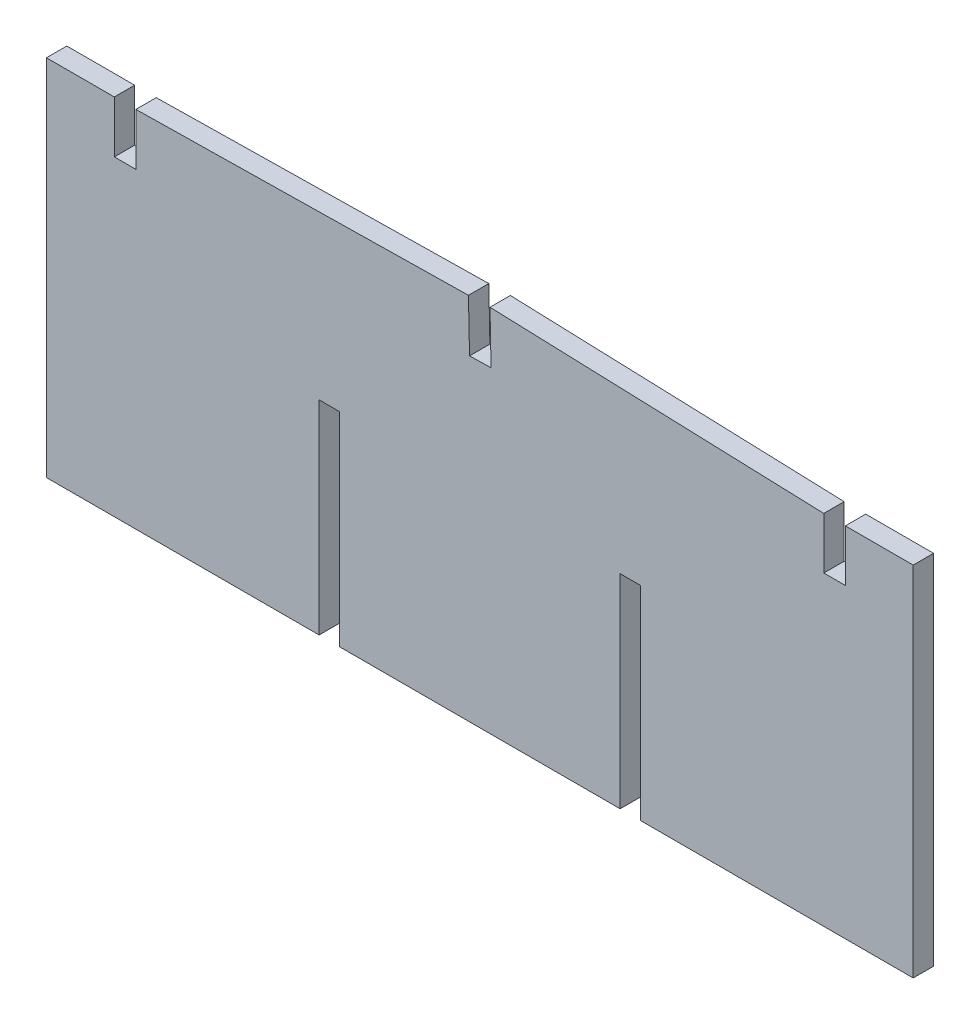
ISO-10303-21;
HEADER;
FILE_DESCRIPTION(('STEP AP214'),'2;1');
FILE_NAME('part.step','',(''),(''),'','','');
FILE_SCHEMA(('AUTOMOTIVE_DESIGN { 1 0 10303 214 1 1 1 1 }'));
ENDSEC;
DATA;
#1=APPLICATION_CONTEXT('core data for automotive mechanical design processes');
#2=APPLICATION_PROTOCOL_DEFINITION('international standard','automotive_design',2000,#1);
#3=PRODUCT_CONTEXT('',#1,'mechanical');
#4=PRODUCT('Part','Part','',(#3));
#5=PRODUCT_RELATED_PRODUCT_CATEGORY('part','',(#4));
#6=PRODUCT_DEFINITION_FORMATION('','',#4);
#7=PRODUCT_DEFINITION_CONTEXT('part definition',#1,'design');
#8=PRODUCT_DEFINITION('design','',#6,#7);
#9=PRODUCT_DEFINITION_SHAPE('','',#8);
#10=(LENGTH_UNIT() NAMED_UNIT(*) SI_UNIT(.MILLI.,.METRE.));
#11=(NAMED_UNIT(*) PLANE_ANGLE_UNIT() SI_UNIT($,.RADIAN.));
#12=(NAMED_UNIT(*) SI_UNIT($,.STERADIAN.) SOLID_ANGLE_UNIT());
#13=UNCERTAINTY_MEASURE_WITH_UNIT(LENGTH_MEASURE(1.E-05),#10,'distance_accuracy_value','');
#14=(GEOMETRIC_REPRESENTATION_CONTEXT(3) GLOBAL_UNCERTAINTY_ASSIGNED_CONTEXT((#13)) GLOBAL_UNIT_ASSIGNED_CONTEXT((#10,
#11,#12)) REPRESENTATION_CONTEXT('',''));
#15=CARTESIAN_POINT('',(0.,0.,0.));
#16=DIRECTION('',(0.,0.,1.));
#17=DIRECTION('',(1.,0.,0.));
#18=AXIS2_PLACEMENT_3D('',#15,#16,#17);
#19=CARTESIAN_POINT('',(374.396000000001,61.5214781068035,-356.));
#20=DIRECTION('',(-1.,0.,0.));
#21=DIRECTION('',(0.,0.,1.));
#22=AXIS2_PLACEMENT_3D('',#19,#20,#21);
#23=PLANE('',#22);
#24=DIRECTION('',(0.,-1.,0.));
#25=VECTOR('',#24,1.);
#26=CARTESIAN_POINT('',(374.396000000001,61.5214781068035,-353.));
#27=LINE('',#26,#25);
#28=CARTESIAN_POINT('',(374.396000000001,69.1249507450922,-353.));
#29=VERTEX_POINT('',#28);
#30=CARTESIAN_POINT('',(374.396000000001,61.5214781068035,-353.));
#31=VERTEX_POINT('',#30);
#32=EDGE_CURVE('E226',#29,#31,#27,.T.);
#33=ORIENTED_EDGE('',*,*,#32,.F.);
#34=DIRECTION('',(0.,0.,1.));
#35=VECTOR('',#34,1.);
#36=CARTESIAN_POINT('',(374.396000000001,69.1249507450922,-356.));
#37=LINE('',#36,#35);
#38=CARTESIAN_POINT('',(374.396000000001,69.1249507450922,-356.));
#39=VERTEX_POINT('',#38);
#40=EDGE_CURVE('E11',#39,#29,#37,.T.);
#41=ORIENTED_EDGE('',*,*,#40,.F.);
#42=DIRECTION('',(0.,-1.,0.));
#43=VECTOR('',#42,1.);
#44=CARTESIAN_POINT('',(374.396000000001,61.5214781068035,-356.));
#45=LINE('',#44,#43);
#46=CARTESIAN_POINT('',(374.396000000001,61.5214781068035,-356.));
#47=VERTEX_POINT('',#46);
#48=EDGE_CURVE('E294',#39,#47,#45,.T.);
#49=ORIENTED_EDGE('',*,*,#48,.T.);
#50=DIRECTION('',(0.,0.,1.));
#51=VECTOR('',#50,1.);
#52=CARTESIAN_POINT('',(374.396000000001,61.5214781068035,-356.));
#53=LINE('',#52,#51);
#54=EDGE_CURVE('E36',#47,#31,#53,.T.);
#55=ORIENTED_EDGE('',*,*,#54,.T.);
#56=EDGE_LOOP('',(#33,#41,#49,#55));
#57=FACE_BOUND('',#56,.T.);
#58=ADVANCED_FACE('F33',(#57),#23,.T.);
#59=CARTESIAN_POINT('',(374.396000000001,69.1249507450922,-356.));
#60=DIRECTION('',(0.,1.,0.));
#61=DIRECTION('',(0.,0.,1.));
#62=AXIS2_PLACEMENT_3D('',#59,#60,#61);
#63=PLANE('',#62);
#64=DIRECTION('',(-1.,0.,0.));
#65=VECTOR('',#64,1.);
#66=CARTESIAN_POINT('',(374.396000000001,69.1249507450922,-353.));
#67=LINE('',#66,#65);
#68=CARTESIAN_POINT('',(384.396000000001,69.1249507450922,-353.));
#69=VERTEX_POINT('',#68);
#70=EDGE_CURVE('E292',#69,#29,#67,.T.);
#71=ORIENTED_EDGE('',*,*,#70,.F.);
#72=DIRECTION('',(0.,0.,1.));
#73=VECTOR('',#72,1.);
#74=CARTESIAN_POINT('',(384.396000000001,69.1249507450922,-356.));
#75=LINE('',#74,#73);
#76=CARTESIAN_POINT('',(384.396000000001,69.1249507450922,-356.));
#77=VERTEX_POINT('',#76);
#78=EDGE_CURVE('E42',#77,#69,#75,.T.);
#79=ORIENTED_EDGE('',*,*,#78,.F.);
#80=DIRECTION('',(-1.,0.,0.));
#81=VECTOR('',#80,1.);
#82=CARTESIAN_POINT('',(374.396000000001,69.1249507450922,-356.));
#83=LINE('',#82,#81);
#84=EDGE_CURVE('E216',#77,#39,#83,.T.);
#85=ORIENTED_EDGE('',*,*,#84,.T.);
#86=ORIENTED_EDGE('',*,*,#40,.T.);
#87=EDGE_LOOP('',(#71,#79,#85,#86));
#88=FACE_BOUND('',#87,.T.);
#89=ADVANCED_FACE('F338',(#88),#63,.T.);
#90=CARTESIAN_POINT('',(384.396000000001,69.1249507450922,-356.));
#91=DIRECTION('',(1.,0.,0.));
#92=DIRECTION('',(0.,0.,-1.));
#93=AXIS2_PLACEMENT_3D('',#90,#91,#92);
#94=PLANE('',#93);
#95=DIRECTION('',(0.,1.,0.));
#96=VECTOR('',#95,1.);
#97=CARTESIAN_POINT('',(384.396000000001,69.1249507450922,-353.));
#98=LINE('',#97,#96);
#99=CARTESIAN_POINT('',(384.396000000001,16.4388254453726,-353.));
#100=VERTEX_POINT('',#99);
#101=EDGE_CURVE('E203',#100,#69,#98,.T.);
#102=ORIENTED_EDGE('',*,*,#101,.F.);
#103=DIRECTION('',(0.,0.,1.));
#104=VECTOR('',#103,1.);
#105=CARTESIAN_POINT('',(384.396000000001,16.4388254453726,-356.));
#106=LINE('',#105,#104);
#107=CARTESIAN_POINT('',(384.396000000001,16.4388254453726,-356.));
#108=VERTEX_POINT('',#107);
#109=EDGE_CURVE('E198',#108,#100,#106,.T.);
#110=ORIENTED_EDGE('',*,*,#109,.F.);
#111=DIRECTION('',(0.,1.,0.));
#112=VECTOR('',#111,1.);
#113=CARTESIAN_POINT('',(384.396000000001,69.1249507450922,-356.));
#114=LINE('',#113,#112);
#115=EDGE_CURVE('E201',#108,#77,#114,.T.);
#116=ORIENTED_EDGE('',*,*,#115,.T.);
#117=ORIENTED_EDGE('',*,*,#78,.T.);
#118=EDGE_LOOP('',(#102,#110,#116,#117));
#119=FACE_BOUND('',#118,.T.);
#120=ADVANCED_FACE('F200',(#119),#94,.T.);
#121=CARTESIAN_POINT('',(384.396000000001,16.4388254453726,-356.));
#122=DIRECTION('',(0.,-1.,0.));
#123=DIRECTION('',(1.,0.,0.));
#124=AXIS2_PLACEMENT_3D('',#121,#122,#123);
#125=PLANE('',#124);
#126=DIRECTION('',(1.,0.,0.));
#127=VECTOR('',#126,1.);
#128=CARTESIAN_POINT('',(384.396000000001,16.4388254453726,-353.));
#129=LINE('',#128,#127);
#130=CARTESIAN_POINT('',(344.221,16.4388254453726,-353.));
#131=VERTEX_POINT('',#130);
#132=EDGE_CURVE('E289',#131,#100,#129,.T.);
#133=ORIENTED_EDGE('',*,*,#132,.F.);
#134=DIRECTION('',(0.,0.,1.));
#135=VECTOR('',#134,1.);
#136=CARTESIAN_POINT('',(344.221,16.4388254453726,-356.));
#137=LINE('',#136,#135);
#138=CARTESIAN_POINT('',(344.221,16.4388254453726,-356.));
#139=VERTEX_POINT('',#138);
#140=EDGE_CURVE('E208',#139,#131,#137,.T.);
#141=ORIENTED_EDGE('',*,*,#140,.F.);
#142=DIRECTION('',(1.,0.,0.));
#143=VECTOR('',#142,1.);
#144=CARTESIAN_POINT('',(384.396000000001,16.4388254453726,-356.));
#145=LINE('',#144,#143);
#146=EDGE_CURVE('E214',#139,#108,#145,.T.);
#147=ORIENTED_EDGE('',*,*,#146,.T.);
#148=ORIENTED_EDGE('',*,*,#109,.T.);
#149=EDGE_LOOP('',(#133,#141,#147,#148));
#150=FACE_BOUND('',#149,.T.);
#151=ADVANCED_FACE('F218',(#150),#125,.T.);
#152=CARTESIAN_POINT('',(344.221,46.4388254453726,-356.));
#153=DIRECTION('',(-1.,0.,0.));
#154=DIRECTION('',(0.,0.,1.));
#155=AXIS2_PLACEMENT_3D('',#152,#153,#154);
#156=PLANE('',#155);
#157=DIRECTION('',(0.,-1.,0.));
#158=VECTOR('',#157,1.);
#159=CARTESIAN_POINT('',(344.221,46.4388254453726,-353.));
#160=LINE('',#159,#158);
#161=CARTESIAN_POINT('',(344.221,46.4388254453726,-353.));
#162=VERTEX_POINT('',#161);
#163=EDGE_CURVE('E286',#162,#131,#160,.T.);
#164=ORIENTED_EDGE('',*,*,#163,.F.);
#165=DIRECTION('',(0.,0.,1.));
#166=VECTOR('',#165,1.);
#167=CARTESIAN_POINT('',(344.221,46.4388254453726,-356.));
#168=LINE('',#167,#166);
#169=CARTESIAN_POINT('',(344.221,46.4388254453726,-356.));
#170=VERTEX_POINT('',#169);
#171=EDGE_CURVE('E298',#170,#162,#168,.T.);
#172=ORIENTED_EDGE('',*,*,#171,.F.);
#173=DIRECTION('',(0.,-1.,0.));
#174=VECTOR('',#173,1.);
#175=CARTESIAN_POINT('',(344.221,46.4388254453726,-356.));
#176=LINE('',#175,#174);
#177=EDGE_CURVE('E219',#170,#139,#176,.T.);
#178=ORIENTED_EDGE('',*,*,#177,.T.);
#179=ORIENTED_EDGE('',*,*,#140,.T.);
#180=EDGE_LOOP('',(#164,#172,#178,#179));
#181=FACE_BOUND('',#180,.T.);
#182=ADVANCED_FACE('F351',(#181),#156,.T.);
#183=CARTESIAN_POINT('',(341.221,46.4388254453726,-356.));
#184=DIRECTION('',(0.,-1.,0.));
#185=DIRECTION('',(0.,0.,-1.));
#186=AXIS2_PLACEMENT_3D('',#183,#184,#185);
#187=PLANE('',#186);
#188=DIRECTION('',(1.,0.,0.));
#189=VECTOR('',#188,1.);
#190=CARTESIAN_POINT('',(341.221,46.4388254453726,-353.));
#191=LINE('',#190,#189);
#192=CARTESIAN_POINT('',(341.221,46.4388254453726,-353.));
#193=VERTEX_POINT('',#192);
#194=EDGE_CURVE('E283',#193,#162,#191,.T.);
#195=ORIENTED_EDGE('',*,*,#194,.F.);
#196=DIRECTION('',(0.,0.,1.));
#197=VECTOR('',#196,1.);
#198=CARTESIAN_POINT('',(341.221,46.4388254453726,-356.));
#199=LINE('',#198,#197);
#200=CARTESIAN_POINT('',(341.221,46.4388254453726,-356.));
#201=VERTEX_POINT('',#200);
#202=EDGE_CURVE('E300',#201,#193,#199,.T.);
#203=ORIENTED_EDGE('',*,*,#202,.F.);
#204=DIRECTION('',(1.,0.,0.));
#205=VECTOR('',#204,1.);
#206=CARTESIAN_POINT('',(341.221,46.4388254453726,-356.));
#207=LINE('',#206,#205);
#208=EDGE_CURVE('E221',#201,#170,#207,.T.);
#209=ORIENTED_EDGE('',*,*,#208,.T.);
#210=ORIENTED_EDGE('',*,*,#171,.T.);
#211=EDGE_LOOP('',(#195,#203,#209,#210));
#212=FACE_BOUND('',#211,.T.);
#213=ADVANCED_FACE('F354',(#212),#187,.T.);
#214=CARTESIAN_POINT('',(341.221,16.4388254453726,-356.));
#215=DIRECTION('',(1.,0.,0.));
#216=DIRECTION('',(0.,0.,-1.));
#217=AXIS2_PLACEMENT_3D('',#214,#215,#216);
#218=PLANE('',#217);
#219=DIRECTION('',(0.,1.,0.));
#220=VECTOR('',#219,1.);
#221=CARTESIAN_POINT('',(341.221,16.4388254453726,-353.));
#222=LINE('',#221,#220);
#223=CARTESIAN_POINT('',(341.221,16.4388254453726,-353.));
#224=VERTEX_POINT('',#223);
#225=EDGE_CURVE('E280',#224,#193,#222,.T.);
#226=ORIENTED_EDGE('',*,*,#225,.F.);
#227=DIRECTION('',(0.,0.,1.));
#228=VECTOR('',#227,1.);
#229=CARTESIAN_POINT('',(341.221,16.4388254453726,-356.));
#230=LINE('',#229,#228);
#231=CARTESIAN_POINT('',(341.221,16.4388254453726,-356.));
#232=VERTEX_POINT('',#231);
#233=EDGE_CURVE('E302',#232,#224,#230,.T.);
#234=ORIENTED_EDGE('',*,*,#233,.F.);
#235=DIRECTION('',(0.,1.,0.));
#236=VECTOR('',#235,1.);
#237=CARTESIAN_POINT('',(341.221,16.4388254453726,-356.));
#238=LINE('',#237,#236);
#239=EDGE_CURVE('E644',#232,#201,#238,.T.);
#240=ORIENTED_EDGE('',*,*,#239,.T.);
#241=ORIENTED_EDGE('',*,*,#202,.T.);
#242=EDGE_LOOP('',(#226,#234,#240,#241));
#243=FACE_BOUND('',#242,.T.);
#244=ADVANCED_FACE('F358',(#243),#218,.T.);
#245=CARTESIAN_POINT('',(341.221,16.4388254453726,-356.));
#246=DIRECTION('',(0.,-1.,0.));
#247=DIRECTION('',(1.,0.,0.));
#248=AXIS2_PLACEMENT_3D('',#245,#246,#247);
#249=PLANE('',#248);
#250=DIRECTION('',(1.,0.,0.));
#251=VECTOR('',#250,1.);
#252=CARTESIAN_POINT('',(341.221,16.4388254453726,-353.));
#253=LINE('',#252,#251);
#254=CARTESIAN_POINT('',(299.875,16.4388254453726,-353.));
#255=VERTEX_POINT('',#254);
#256=EDGE_CURVE('E277',#255,#224,#253,.T.);
#257=ORIENTED_EDGE('',*,*,#256,.F.);
#258=DIRECTION('',(0.,0.,1.));
#259=VECTOR('',#258,1.);
#260=CARTESIAN_POINT('',(299.875,16.4388254453726,-356.));
#261=LINE('',#260,#259);
#262=CARTESIAN_POINT('',(299.875,16.4388254453726,-356.));
#263=VERTEX_POINT('',#262);
#264=EDGE_CURVE('E304',#263,#255,#261,.T.);
#265=ORIENTED_EDGE('',*,*,#264,.F.);
#266=DIRECTION('',(1.,0.,0.));
#267=VECTOR('',#266,1.);
#268=CARTESIAN_POINT('',(341.221,16.4388254453726,-356.));
#269=LINE('',#268,#267);
#270=EDGE_CURVE('E648',#263,#232,#269,.T.);
#271=ORIENTED_EDGE('',*,*,#270,.T.);
#272=ORIENTED_EDGE('',*,*,#233,.T.);
#273=EDGE_LOOP('',(#257,#265,#271,#272));
#274=FACE_BOUND('',#273,.T.);
#275=ADVANCED_FACE('F362',(#274),#249,.T.);
#276=CARTESIAN_POINT('',(299.875,46.4388254453726,-356.));
#277=DIRECTION('',(-1.,0.,0.));
#278=DIRECTION('',(0.,0.,1.));
#279=AXIS2_PLACEMENT_3D('',#276,#277,#278);
#280=PLANE('',#279);
#281=DIRECTION('',(0.,-1.,0.));
#282=VECTOR('',#281,1.);
#283=CARTESIAN_POINT('',(299.875,46.4388254453726,-353.));
#284=LINE('',#283,#282);
#285=CARTESIAN_POINT('',(299.875,46.4388254453726,-353.));
#286=VERTEX_POINT('',#285);
#287=EDGE_CURVE('E274',#286,#255,#284,.T.);
#288=ORIENTED_EDGE('',*,*,#287,.F.);
#289=DIRECTION('',(0.,0.,1.));
#290=VECTOR('',#289,1.);
#291=CARTESIAN_POINT('',(299.875,46.4388254453726,-356.));
#292=LINE('',#291,#290);
#293=CARTESIAN_POINT('',(299.875,46.4388254453726,-356.));
#294=VERTEX_POINT('',#293);
#295=EDGE_CURVE('E306',#294,#286,#292,.T.);
#296=ORIENTED_EDGE('',*,*,#295,.F.);
#297=DIRECTION('',(0.,-1.,0.));
#298=VECTOR('',#297,1.);
#299=CARTESIAN_POINT('',(299.875,46.4388254453726,-356.));
#300=LINE('',#299,#298);
#301=EDGE_CURVE('E637',#294,#263,#300,.T.);
#302=ORIENTED_EDGE('',*,*,#301,.T.);
#303=ORIENTED_EDGE('',*,*,#264,.T.);
#304=EDGE_LOOP('',(#288,#296,#302,#303));
#305=FACE_BOUND('',#304,.T.);
#306=ADVANCED_FACE('F366',(#305),#280,.T.);
#307=CARTESIAN_POINT('',(296.875,46.4388254453726,-356.));
#308=DIRECTION('',(0.,-1.,0.));
#309=DIRECTION('',(0.,0.,-1.));
#310=AXIS2_PLACEMENT_3D('',#307,#308,#309);
#311=PLANE('',#310);
#312=DIRECTION('',(1.,0.,0.));
#313=VECTOR('',#312,1.);
#314=CARTESIAN_POINT('',(296.875,46.4388254453726,-353.));
#315=LINE('',#314,#313);
#316=CARTESIAN_POINT('',(296.875,46.4388254453726,-353.));
#317=VERTEX_POINT('',#316);
#318=EDGE_CURVE('E271',#317,#286,#315,.T.);
#319=ORIENTED_EDGE('',*,*,#318,.F.);
#320=DIRECTION('',(0.,0.,1.));
#321=VECTOR('',#320,1.);
#322=CARTESIAN_POINT('',(296.875,46.4388254453726,-356.));
#323=LINE('',#322,#321);
#324=CARTESIAN_POINT('',(296.875,46.4388254453726,-356.));
#325=VERTEX_POINT('',#324);
#326=EDGE_CURVE('E308',#325,#317,#323,.T.);
#327=ORIENTED_EDGE('',*,*,#326,.F.);
#328=DIRECTION('',(1.,0.,0.));
#329=VECTOR('',#328,1.);
#330=CARTESIAN_POINT('',(296.875,46.4388254453726,-356.));
#331=LINE('',#330,#329);
#332=EDGE_CURVE('E633',#325,#294,#331,.T.);
#333=ORIENTED_EDGE('',*,*,#332,.T.);
#334=ORIENTED_EDGE('',*,*,#295,.T.);
#335=EDGE_LOOP('',(#319,#327,#333,#334));
#336=FACE_BOUND('',#335,.T.);
#337=ADVANCED_FACE('F370',(#336),#311,.T.);
#338=CARTESIAN_POINT('',(296.875,16.4388254453726,-356.));
#339=DIRECTION('',(1.,0.,0.));
#340=DIRECTION('',(0.,0.,-1.));
#341=AXIS2_PLACEMENT_3D('',#338,#339,#340);
#342=PLANE('',#341);
#343=DIRECTION('',(0.,1.,0.));
#344=VECTOR('',#343,1.);
#345=CARTESIAN_POINT('',(296.875,16.4388254453726,-353.));
#346=LINE('',#345,#344);
#347=CARTESIAN_POINT('',(296.875,16.4388254453726,-353.));
#348=VERTEX_POINT('',#347);
#349=EDGE_CURVE('E268',#348,#317,#346,.T.);
#350=ORIENTED_EDGE('',*,*,#349,.F.);
#351=DIRECTION('',(0.,0.,1.));
#352=VECTOR('',#351,1.);
#353=CARTESIAN_POINT('',(296.875,16.4388254453726,-356.));
#354=LINE('',#353,#352);
#355=CARTESIAN_POINT('',(296.875,16.4388254453726,-356.));
#356=VERTEX_POINT('',#355);
#357=EDGE_CURVE('E310',#356,#348,#354,.T.);
#358=ORIENTED_EDGE('',*,*,#357,.F.);
#359=DIRECTION('',(0.,1.,0.));
#360=VECTOR('',#359,1.);
#361=CARTESIAN_POINT('',(296.875,16.4388254453726,-356.));
#362=LINE('',#361,#360);
#363=EDGE_CURVE('E654',#356,#325,#362,.T.);
#364=ORIENTED_EDGE('',*,*,#363,.T.);
#365=ORIENTED_EDGE('',*,*,#326,.T.);
#366=EDGE_LOOP('',(#350,#358,#364,#365));
#367=FACE_BOUND('',#366,.T.);
#368=ADVANCED_FACE('F374',(#367),#342,.T.);
#369=CARTESIAN_POINT('',(296.875,16.4388254453726,-356.));
#370=DIRECTION('',(0.,-1.,0.));
#371=DIRECTION('',(1.,0.,0.));
#372=AXIS2_PLACEMENT_3D('',#369,#370,#371);
#373=PLANE('',#372);
#374=DIRECTION('',(1.,0.,0.));
#375=VECTOR('',#374,1.);
#376=CARTESIAN_POINT('',(296.875,16.4388254453726,-353.));
#377=LINE('',#376,#375);
#378=CARTESIAN_POINT('',(256.7,16.4388254453726,-353.));
#379=VERTEX_POINT('',#378);
#380=EDGE_CURVE('E265',#379,#348,#377,.T.);
#381=ORIENTED_EDGE('',*,*,#380,.F.);
#382=DIRECTION('',(0.,0.,1.));
#383=VECTOR('',#382,1.);
#384=CARTESIAN_POINT('',(256.7,16.4388254453726,-356.));
#385=LINE('',#384,#383);
#386=CARTESIAN_POINT('',(256.7,16.4388254453726,-356.));
#387=VERTEX_POINT('',#386);
#388=EDGE_CURVE('E312',#387,#379,#385,.T.);
#389=ORIENTED_EDGE('',*,*,#388,.F.);
#390=DIRECTION('',(1.,0.,0.));
#391=VECTOR('',#390,1.);
#392=CARTESIAN_POINT('',(296.875,16.4388254453726,-356.));
#393=LINE('',#392,#391);
#394=EDGE_CURVE('E626',#387,#356,#393,.T.);
#395=ORIENTED_EDGE('',*,*,#394,.T.);
#396=ORIENTED_EDGE('',*,*,#357,.T.);
#397=EDGE_LOOP('',(#381,#389,#395,#396));
#398=FACE_BOUND('',#397,.T.);
#399=ADVANCED_FACE('F378',(#398),#373,.T.);
#400=CARTESIAN_POINT('',(256.7,16.4388254453726,-356.));
#401=DIRECTION('',(-1.,0.,0.));
#402=DIRECTION('',(0.,0.,1.));
#403=AXIS2_PLACEMENT_3D('',#400,#401,#402);
#404=PLANE('',#403);
#405=DIRECTION('',(0.,-1.,0.));
#406=VECTOR('',#405,1.);
#407=CARTESIAN_POINT('',(256.7,16.4388254453726,-353.));
#408=LINE('',#407,#406);
#409=CARTESIAN_POINT('',(256.7,69.9992734705598,-353.));
#410=VERTEX_POINT('',#409);
#411=EDGE_CURVE('E262',#410,#379,#408,.T.);
#412=ORIENTED_EDGE('',*,*,#411,.F.);
#413=DIRECTION('',(0.,0.,1.));
#414=VECTOR('',#413,1.);
#415=CARTESIAN_POINT('',(256.7,69.9992734705598,-356.));
#416=LINE('',#415,#414);
#417=CARTESIAN_POINT('',(256.7,69.9992734705598,-356.));
#418=VERTEX_POINT('',#417);
#419=EDGE_CURVE('E314',#418,#410,#416,.T.);
#420=ORIENTED_EDGE('',*,*,#419,.F.);
#421=DIRECTION('',(0.,-1.,0.));
#422=VECTOR('',#421,1.);
#423=CARTESIAN_POINT('',(256.7,16.4388254453726,-356.));
#424=LINE('',#423,#422);
#425=EDGE_CURVE('E622',#418,#387,#424,.T.);
#426=ORIENTED_EDGE('',*,*,#425,.T.);
#427=ORIENTED_EDGE('',*,*,#388,.T.);
#428=EDGE_LOOP('',(#412,#420,#426,#427));
#429=FACE_BOUND('',#428,.T.);
#430=ADVANCED_FACE('F382',(#429),#404,.T.);
#431=CARTESIAN_POINT('',(256.7,69.9992734705598,-356.));
#432=DIRECTION('',(0.,1.,0.));
#433=DIRECTION('',(0.,0.,1.));
#434=AXIS2_PLACEMENT_3D('',#431,#432,#433);
#435=PLANE('',#434);
#436=DIRECTION('',(-1.,0.,0.));
#437=VECTOR('',#436,1.);
#438=CARTESIAN_POINT('',(256.7,69.9992734705598,-353.));
#439=LINE('',#438,#437);
#440=CARTESIAN_POINT('',(266.7,69.9992734705598,-353.));
#441=VERTEX_POINT('',#440);
#442=EDGE_CURVE('E259',#441,#410,#439,.T.);
#443=ORIENTED_EDGE('',*,*,#442,.F.);
#444=DIRECTION('',(0.,0.,1.));
#445=VECTOR('',#444,1.);
#446=CARTESIAN_POINT('',(266.7,69.9992734705598,-356.));
#447=LINE('',#446,#445);
#448=CARTESIAN_POINT('',(266.7,69.9992734705598,-356.));
#449=VERTEX_POINT('',#448);
#450=EDGE_CURVE('E316',#449,#441,#447,.T.);
#451=ORIENTED_EDGE('',*,*,#450,.F.);
#452=DIRECTION('',(-1.,0.,0.));
#453=VECTOR('',#452,1.);
#454=CARTESIAN_POINT('',(256.7,69.9992734705598,-356.));
#455=LINE('',#454,#453);
#456=EDGE_CURVE('E658',#449,#418,#455,.T.);
#457=ORIENTED_EDGE('',*,*,#456,.T.);
#458=ORIENTED_EDGE('',*,*,#419,.T.);
#459=EDGE_LOOP('',(#443,#451,#457,#458));
#460=FACE_BOUND('',#459,.T.);
#461=ADVANCED_FACE('F386',(#460),#435,.T.);
#462=CARTESIAN_POINT('',(266.7,69.9992734705598,-356.));
#463=DIRECTION('',(1.,0.,0.));
#464=DIRECTION('',(0.,0.,-1.));
#465=AXIS2_PLACEMENT_3D('',#462,#463,#464);
#466=PLANE('',#465);
#467=DIRECTION('',(0.,1.,0.));
#468=VECTOR('',#467,1.);
#469=CARTESIAN_POINT('',(266.7,69.9992734705598,-353.));
#470=LINE('',#469,#468);
#471=CARTESIAN_POINT('',(266.7,62.3492117448481,-353.));
#472=VERTEX_POINT('',#471);
#473=EDGE_CURVE('E256',#472,#441,#470,.T.);
#474=ORIENTED_EDGE('',*,*,#473,.F.);
#475=DIRECTION('',(0.,0.,1.));
#476=VECTOR('',#475,1.);
#477=CARTESIAN_POINT('',(266.7,62.3492117448481,-356.));
#478=LINE('',#477,#476);
#479=CARTESIAN_POINT('',(266.7,62.3492117448481,-356.));
#480=VERTEX_POINT('',#479);
#481=EDGE_CURVE('E318',#480,#472,#478,.T.);
#482=ORIENTED_EDGE('',*,*,#481,.F.);
#483=DIRECTION('',(0.,1.,0.));
#484=VECTOR('',#483,1.);
#485=CARTESIAN_POINT('',(266.7,69.9992734705598,-356.));
#486=LINE('',#485,#484);
#487=EDGE_CURVE('E615',#480,#449,#486,.T.);
#488=ORIENTED_EDGE('',*,*,#487,.T.);
#489=ORIENTED_EDGE('',*,*,#450,.T.);
#490=EDGE_LOOP('',(#474,#482,#488,#489));
#491=FACE_BOUND('',#490,.T.);
#492=ADVANCED_FACE('F390',(#491),#466,.T.);
#493=CARTESIAN_POINT('',(266.7,62.3492117448481,-356.));
#494=DIRECTION('',(0.,1.,0.));
#495=DIRECTION('',(0.,0.,1.));
#496=AXIS2_PLACEMENT_3D('',#493,#494,#495);
#497=PLANE('',#496);
#498=DIRECTION('',(-1.,0.,0.));
#499=VECTOR('',#498,1.);
#500=CARTESIAN_POINT('',(266.7,62.3492117448481,-353.));
#501=LINE('',#500,#499);
#502=CARTESIAN_POINT('',(269.875,62.3492117448481,-353.));
#503=VERTEX_POINT('',#502);
#504=EDGE_CURVE('E253',#503,#472,#501,.T.);
#505=ORIENTED_EDGE('',*,*,#504,.F.);
#506=DIRECTION('',(0.,0.,1.));
#507=VECTOR('',#506,1.);
#508=CARTESIAN_POINT('',(269.875,62.3492117448481,-356.));
#509=LINE('',#508,#507);
#510=CARTESIAN_POINT('',(269.875,62.3492117448481,-356.));
#511=VERTEX_POINT('',#510);
#512=EDGE_CURVE('E320',#511,#503,#509,.T.);
#513=ORIENTED_EDGE('',*,*,#512,.F.);
#514=DIRECTION('',(-1.,0.,0.));
#515=VECTOR('',#514,1.);
#516=CARTESIAN_POINT('',(266.7,62.3492117448481,-356.));
#517=LINE('',#516,#515);
#518=EDGE_CURVE('E611',#511,#480,#517,.T.);
#519=ORIENTED_EDGE('',*,*,#518,.T.);
#520=ORIENTED_EDGE('',*,*,#481,.T.);
#521=EDGE_LOOP('',(#505,#513,#519,#520));
#522=FACE_BOUND('',#521,.T.);
#523=ADVANCED_FACE('F394',(#522),#497,.T.);
#524=CARTESIAN_POINT('',(269.875,69.9992758786835,-356.));
#525=DIRECTION('',(-1.,0.,0.));
#526=DIRECTION('',(0.,0.,1.));
#527=AXIS2_PLACEMENT_3D('',#524,#525,#526);
#528=PLANE('',#527);
#529=DIRECTION('',(0.,-1.,0.));
#530=VECTOR('',#529,1.);
#531=CARTESIAN_POINT('',(269.875,69.9992758786835,-353.));
#532=LINE('',#531,#530);
#533=CARTESIAN_POINT('',(269.875,69.9992758786835,-353.));
#534=VERTEX_POINT('',#533);
#535=EDGE_CURVE('E250',#534,#503,#532,.T.);
#536=ORIENTED_EDGE('',*,*,#535,.F.);
#537=DIRECTION('',(0.,0.,1.));
#538=VECTOR('',#537,1.);
#539=CARTESIAN_POINT('',(269.875,69.9992758786835,-356.));
#540=LINE('',#539,#538);
#541=CARTESIAN_POINT('',(269.875,69.9992758786835,-356.));
#542=VERTEX_POINT('',#541);
#543=EDGE_CURVE('E322',#542,#534,#540,.T.);
#544=ORIENTED_EDGE('',*,*,#543,.F.);
#545=DIRECTION('',(0.,-1.,0.));
#546=VECTOR('',#545,1.);
#547=CARTESIAN_POINT('',(269.875,69.9992758786835,-356.));
#548=LINE('',#547,#546);
#549=EDGE_CURVE('E662',#542,#511,#548,.T.);
#550=ORIENTED_EDGE('',*,*,#549,.T.);
#551=ORIENTED_EDGE('',*,*,#512,.T.);
#552=EDGE_LOOP('',(#536,#544,#550,#551));
#553=FACE_BOUND('',#552,.T.);
#554=ADVANCED_FACE('F398',(#553),#528,.T.);
#555=CARTESIAN_POINT('',(269.875,69.9992758786835,-356.));
#556=DIRECTION('',(-0.0159295770575242,0.999873116237639,0.));
#557=DIRECTION('',(-0.99987311623764,-0.0159295770575242,0.));
#558=AXIS2_PLACEMENT_3D('',#555,#556,#557);
#559=PLANE('',#558);
#560=DIRECTION('',(-0.99987311623764,-0.0159295770575242,0.));
#561=VECTOR('',#560,1.);
#562=CARTESIAN_POINT('',(269.875,69.9992758786835,-353.));
#563=LINE('',#562,#561);
#564=CARTESIAN_POINT('',(318.872542601998,70.7798850558207,-353.));
#565=VERTEX_POINT('',#564);
#566=EDGE_CURVE('E247',#565,#534,#563,.T.);
#567=ORIENTED_EDGE('',*,*,#566,.F.);
#568=DIRECTION('',(0.,0.,1.));
#569=VECTOR('',#568,1.);
#570=CARTESIAN_POINT('',(318.872542601998,70.7798850558207,-356.));
#571=LINE('',#570,#569);
#572=CARTESIAN_POINT('',(318.872542601998,70.7798850558207,-356.));
#573=VERTEX_POINT('',#572);
#574=EDGE_CURVE('E324',#573,#565,#571,.T.);
#575=ORIENTED_EDGE('',*,*,#574,.F.);
#576=DIRECTION('',(-0.99987311623764,-0.0159295770575242,0.));
#577=VECTOR('',#576,1.);
#578=CARTESIAN_POINT('',(269.875,69.9992758786835,-356.));
#579=LINE('',#578,#577);
#580=EDGE_CURVE('E604',#573,#542,#579,.T.);
#581=ORIENTED_EDGE('',*,*,#580,.T.);
#582=ORIENTED_EDGE('',*,*,#543,.T.);
#583=EDGE_LOOP('',(#567,#575,#581,#582));
#584=FACE_BOUND('',#583,.T.);
#585=ADVANCED_FACE('F402',(#584),#559,.T.);
#586=CARTESIAN_POINT('',(318.872542601998,70.7798850558207,-356.));
#587=DIRECTION('',(0.999785281478118,0.0207217504019521,0.));
#588=DIRECTION('',(-0.0207217504019521,0.999785281478118,0.));
#589=AXIS2_PLACEMENT_3D('',#586,#587,#588);
#590=PLANE('',#589);
#591=DIRECTION('',(-0.0207217504019521,0.999785281478118,0.));
#592=VECTOR('',#591,1.);
#593=CARTESIAN_POINT('',(318.872542601998,70.7798850558207,-353.));
#594=LINE('',#593,#592);
#595=CARTESIAN_POINT('',(319.031094475896,63.1300568898072,-353.));
#596=VERTEX_POINT('',#595);
#597=EDGE_CURVE('E244',#596,#565,#594,.T.);
#598=ORIENTED_EDGE('',*,*,#597,.F.);
#599=DIRECTION('',(0.,0.,1.));
#600=VECTOR('',#599,1.);
#601=CARTESIAN_POINT('',(319.031094475896,63.1300568898072,-356.));
#602=LINE('',#601,#600);
#603=CARTESIAN_POINT('',(319.031094475896,63.1300568898072,-356.));
#604=VERTEX_POINT('',#603);
#605=EDGE_CURVE('E326',#604,#596,#602,.T.);
#606=ORIENTED_EDGE('',*,*,#605,.F.);
#607=DIRECTION('',(-0.0207217504019521,0.999785281478118,0.));
#608=VECTOR('',#607,1.);
#609=CARTESIAN_POINT('',(318.872542601998,70.7798850558207,-356.));
#610=LINE('',#609,#608);
#611=EDGE_CURVE('E600',#604,#573,#610,.T.);
#612=ORIENTED_EDGE('',*,*,#611,.T.);
#613=ORIENTED_EDGE('',*,*,#574,.T.);
#614=EDGE_LOOP('',(#598,#606,#612,#613));
#615=FACE_BOUND('',#614,.T.);
#616=ADVANCED_FACE('F406',(#615),#590,.T.);
#617=CARTESIAN_POINT('',(319.031094475896,63.1300568898072,-356.));
#618=DIRECTION('',(-0.0206821283430058,0.999786101907405,0.));
#619=DIRECTION('',(-0.999786101907405,-0.0206821283430058,0.));
#620=AXIS2_PLACEMENT_3D('',#617,#618,#619);
#621=PLANE('',#620);
#622=DIRECTION('',(-0.999786101907405,-0.0206821283430058,0.));
#623=VECTOR('',#622,1.);
#624=CARTESIAN_POINT('',(319.031094475896,63.1300568898072,-353.));
#625=LINE('',#624,#623);
#626=CARTESIAN_POINT('',(322.205416714942,63.1957226755435,-353.));
#627=VERTEX_POINT('',#626);
#628=EDGE_CURVE('E241',#627,#596,#625,.T.);
#629=ORIENTED_EDGE('',*,*,#628,.F.);
#630=DIRECTION('',(0.,0.,1.));
#631=VECTOR('',#630,1.);
#632=CARTESIAN_POINT('',(322.205416714942,63.1957226755435,-356.));
#633=LINE('',#632,#631);
#634=CARTESIAN_POINT('',(322.205416714942,63.1957226755435,-356.));
#635=VERTEX_POINT('',#634);
#636=EDGE_CURVE('E328',#635,#627,#633,.T.);
#637=ORIENTED_EDGE('',*,*,#636,.F.);
#638=DIRECTION('',(-0.999786101907405,-0.0206821283430058,0.));
#639=VECTOR('',#638,1.);
#640=CARTESIAN_POINT('',(319.031094475896,63.1300568898072,-356.));
#641=LINE('',#640,#639);
#642=EDGE_CURVE('E666',#635,#604,#641,.T.);
#643=ORIENTED_EDGE('',*,*,#642,.T.);
#644=ORIENTED_EDGE('',*,*,#605,.T.);
#645=EDGE_LOOP('',(#629,#637,#643,#644));
#646=FACE_BOUND('',#645,.T.);
#647=ADVANCED_FACE('F410',(#646),#621,.T.);
#648=CARTESIAN_POINT('',(322.04686478691,70.8455534510291,-356.));
#649=DIRECTION('',(-0.999785281477982,-0.0207217504085172,0.));
#650=DIRECTION('',(0.0207217504085172,-0.999785281477982,0.));
#651=AXIS2_PLACEMENT_3D('',#648,#649,#650);
#652=PLANE('',#651);
#653=DIRECTION('',(0.0207217504085172,-0.999785281477982,0.));
#654=VECTOR('',#653,1.);
#655=CARTESIAN_POINT('',(322.04686478691,70.8455534510291,-353.));
#656=LINE('',#655,#654);
#657=CARTESIAN_POINT('',(322.04686478691,70.8455534510291,-353.));
#658=VERTEX_POINT('',#657);
#659=EDGE_CURVE('E238',#658,#627,#656,.T.);
#660=ORIENTED_EDGE('',*,*,#659,.F.);
#661=DIRECTION('',(0.,0.,1.));
#662=VECTOR('',#661,1.);
#663=CARTESIAN_POINT('',(322.04686478691,70.8455534510291,-356.));
#664=LINE('',#663,#662);
#665=CARTESIAN_POINT('',(322.04686478691,70.8455534510291,-356.));
#666=VERTEX_POINT('',#665);
#667=EDGE_CURVE('E330',#666,#658,#664,.T.);
#668=ORIENTED_EDGE('',*,*,#667,.F.);
#669=DIRECTION('',(0.0207217504085172,-0.999785281477982,0.));
#670=VECTOR('',#669,1.);
#671=CARTESIAN_POINT('',(322.04686478691,70.8455534510291,-356.));
#672=LINE('',#671,#670);
#673=EDGE_CURVE('E593',#666,#635,#672,.T.);
#674=ORIENTED_EDGE('',*,*,#673,.T.);
#675=ORIENTED_EDGE('',*,*,#636,.T.);
#676=EDGE_LOOP('',(#660,#668,#674,#675));
#677=FACE_BOUND('',#676,.T.);
#678=ADVANCED_FACE('F414',(#677),#652,.T.);
#679=CARTESIAN_POINT('',(322.04686478691,70.8455534510291,-356.));
#680=DIRECTION('',(0.0349686571978685,0.99938840948541,0.));
#681=DIRECTION('',(-0.99938840948541,0.0349686571978685,0.));
#682=AXIS2_PLACEMENT_3D('',#679,#680,#681);
#683=PLANE('',#682);
#684=DIRECTION('',(-0.99938840948541,0.0349686571978685,0.));
#685=VECTOR('',#684,1.);
#686=CARTESIAN_POINT('',(322.04686478691,70.8455534510291,-353.));
#687=LINE('',#686,#685);
#688=CARTESIAN_POINT('',(371.221000000001,69.1249476675844,-353.));
#689=VERTEX_POINT('',#688);
#690=EDGE_CURVE('E235',#689,#658,#687,.T.);
#691=ORIENTED_EDGE('',*,*,#690,.F.);
#692=DIRECTION('',(0.,0.,1.));
#693=VECTOR('',#692,1.);
#694=CARTESIAN_POINT('',(371.221000000001,69.1249476675844,-356.));
#695=LINE('',#694,#693);
#696=CARTESIAN_POINT('',(371.221000000001,69.1249476675844,-356.));
#697=VERTEX_POINT('',#696);
#698=EDGE_CURVE('E332',#697,#689,#695,.T.);
#699=ORIENTED_EDGE('',*,*,#698,.F.);
#700=DIRECTION('',(-0.99938840948541,0.0349686571978685,0.));
#701=VECTOR('',#700,1.);
#702=CARTESIAN_POINT('',(322.04686478691,70.8455534510291,-356.));
#703=LINE('',#702,#701);
#704=EDGE_CURVE('E589',#697,#666,#703,.T.);
#705=ORIENTED_EDGE('',*,*,#704,.T.);
#706=ORIENTED_EDGE('',*,*,#667,.T.);
#707=EDGE_LOOP('',(#691,#699,#705,#706));
#708=FACE_BOUND('',#707,.T.);
#709=ADVANCED_FACE('F418',(#708),#683,.T.);
#710=CARTESIAN_POINT('',(371.221000000001,61.5214781068035,-356.));
#711=DIRECTION('',(1.,0.,0.));
#712=DIRECTION('',(0.,0.,-1.));
#713=AXIS2_PLACEMENT_3D('',#710,#711,#712);
#714=PLANE('',#713);
#715=DIRECTION('',(0.,1.,0.));
#716=VECTOR('',#715,1.);
#717=CARTESIAN_POINT('',(371.221000000001,61.5214781068035,-353.));
#718=LINE('',#717,#716);
#719=CARTESIAN_POINT('',(371.221000000001,61.5214781068035,-353.));
#720=VERTEX_POINT('',#719);
#721=EDGE_CURVE('E232',#720,#689,#718,.T.);
#722=ORIENTED_EDGE('',*,*,#721,.F.);
#723=DIRECTION('',(0.,0.,1.));
#724=VECTOR('',#723,1.);
#725=CARTESIAN_POINT('',(371.221000000001,61.5214781068035,-356.));
#726=LINE('',#725,#724);
#727=CARTESIAN_POINT('',(371.221000000001,61.5214781068035,-356.));
#728=VERTEX_POINT('',#727);
#729=EDGE_CURVE('E333',#728,#720,#726,.T.);
#730=ORIENTED_EDGE('',*,*,#729,.F.);
#731=DIRECTION('',(0.,1.,0.));
#732=VECTOR('',#731,1.);
#733=CARTESIAN_POINT('',(371.221000000001,61.5214781068035,-356.));
#734=LINE('',#733,#732);
#735=EDGE_CURVE('E670',#728,#697,#734,.T.);
#736=ORIENTED_EDGE('',*,*,#735,.T.);
#737=ORIENTED_EDGE('',*,*,#698,.T.);
#738=EDGE_LOOP('',(#722,#730,#736,#737));
#739=FACE_BOUND('',#738,.T.);
#740=ADVANCED_FACE('F422',(#739),#714,.T.);
#741=CARTESIAN_POINT('',(371.221000000001,61.5214781068035,-356.));
#742=DIRECTION('',(0.,1.,0.));
#743=DIRECTION('',(0.,0.,1.));
#744=AXIS2_PLACEMENT_3D('',#741,#742,#743);
#745=PLANE('',#744);
#746=DIRECTION('',(-1.,0.,0.));
#747=VECTOR('',#746,1.);
#748=CARTESIAN_POINT('',(371.221000000001,61.5214781068035,-353.));
#749=LINE('',#748,#747);
#750=EDGE_CURVE('E229',#31,#720,#749,.T.);
#751=ORIENTED_EDGE('',*,*,#750,.F.);
#752=ORIENTED_EDGE('',*,*,#54,.F.);
#753=DIRECTION('',(-1.,0.,0.));
#754=VECTOR('',#753,1.);
#755=CARTESIAN_POINT('',(371.221000000001,61.5214781068035,-356.));
#756=LINE('',#755,#754);
#757=EDGE_CURVE('E672',#47,#728,#756,.T.);
#758=ORIENTED_EDGE('',*,*,#757,.T.);
#759=ORIENTED_EDGE('',*,*,#729,.T.);
#760=EDGE_LOOP('',(#751,#752,#758,#759));
#761=FACE_BOUND('',#760,.T.);
#762=ADVANCED_FACE('F335',(#761),#745,.T.);
#763=CARTESIAN_POINT('',(0.,0.,-356.));
#764=DIRECTION('',(0.,0.,-1.));
#765=DIRECTION('',(-1.,0.,0.));
#766=AXIS2_PLACEMENT_3D('',#763,#764,#765);
#767=PLANE('',#766);
#768=ORIENTED_EDGE('',*,*,#48,.F.);
#769=ORIENTED_EDGE('',*,*,#84,.F.);
#770=ORIENTED_EDGE('',*,*,#115,.F.);
#771=ORIENTED_EDGE('',*,*,#146,.F.);
#772=ORIENTED_EDGE('',*,*,#177,.F.);
#773=ORIENTED_EDGE('',*,*,#208,.F.);
#774=ORIENTED_EDGE('',*,*,#239,.F.);
#775=ORIENTED_EDGE('',*,*,#270,.F.);
#776=ORIENTED_EDGE('',*,*,#301,.F.);
#777=ORIENTED_EDGE('',*,*,#332,.F.);
#778=ORIENTED_EDGE('',*,*,#363,.F.);
#779=ORIENTED_EDGE('',*,*,#394,.F.);
#780=ORIENTED_EDGE('',*,*,#425,.F.);
#781=ORIENTED_EDGE('',*,*,#456,.F.);
#782=ORIENTED_EDGE('',*,*,#487,.F.);
#783=ORIENTED_EDGE('',*,*,#518,.F.);
#784=ORIENTED_EDGE('',*,*,#549,.F.);
#785=ORIENTED_EDGE('',*,*,#580,.F.);
#786=ORIENTED_EDGE('',*,*,#611,.F.);
#787=ORIENTED_EDGE('',*,*,#642,.F.);
#788=ORIENTED_EDGE('',*,*,#673,.F.);
#789=ORIENTED_EDGE('',*,*,#704,.F.);
#790=ORIENTED_EDGE('',*,*,#735,.F.);
#791=ORIENTED_EDGE('',*,*,#757,.F.);
#792=EDGE_LOOP('',(#768,#769,#770,#771,#772,#773,#774,#775,#776,#777,#778,#779,#780,#781,#782,
#783,#784,#785,#786,#787,#788,#789,#790,#791));
#793=FACE_BOUND('',#792,.T.);
#794=ADVANCED_FACE('F212',(#793),#767,.T.);
#795=CARTESIAN_POINT('',(0.,0.,-353.));
#796=DIRECTION('',(0.,0.,-1.));
#797=DIRECTION('',(-1.,0.,0.));
#798=AXIS2_PLACEMENT_3D('',#795,#796,#797);
#799=PLANE('',#798);
#800=ORIENTED_EDGE('',*,*,#32,.T.);
#801=ORIENTED_EDGE('',*,*,#750,.T.);
#802=ORIENTED_EDGE('',*,*,#721,.T.);
#803=ORIENTED_EDGE('',*,*,#690,.T.);
#804=ORIENTED_EDGE('',*,*,#659,.T.);
#805=ORIENTED_EDGE('',*,*,#628,.T.);
#806=ORIENTED_EDGE('',*,*,#597,.T.);
#807=ORIENTED_EDGE('',*,*,#566,.T.);
#808=ORIENTED_EDGE('',*,*,#535,.T.);
#809=ORIENTED_EDGE('',*,*,#504,.T.);
#810=ORIENTED_EDGE('',*,*,#473,.T.);
#811=ORIENTED_EDGE('',*,*,#442,.T.);
#812=ORIENTED_EDGE('',*,*,#411,.T.);
#813=ORIENTED_EDGE('',*,*,#380,.T.);
#814=ORIENTED_EDGE('',*,*,#349,.T.);
#815=ORIENTED_EDGE('',*,*,#318,.T.);
#816=ORIENTED_EDGE('',*,*,#287,.T.);
#817=ORIENTED_EDGE('',*,*,#256,.T.);
#818=ORIENTED_EDGE('',*,*,#225,.T.);
#819=ORIENTED_EDGE('',*,*,#194,.T.);
#820=ORIENTED_EDGE('',*,*,#163,.T.);
#821=ORIENTED_EDGE('',*,*,#132,.T.);
#822=ORIENTED_EDGE('',*,*,#101,.T.);
#823=ORIENTED_EDGE('',*,*,#70,.T.);
#824=EDGE_LOOP('',(#800,#801,#802,#803,#804,#805,#806,#807,#808,#809,#810,#811,#812,#813,#814,
#815,#816,#817,#818,#819,#820,#821,#822,#823));
#825=FACE_BOUND('',#824,.T.);
#826=ADVANCED_FACE('F337',(#825),#799,.F.);
#827=CLOSED_SHELL('',(#58,#89,#120,#151,#182,#213,#244,#275,#306,#337,#368,#399,#430,#461,#492,
#523,#554,#585,#616,#647,#678,#709,#740,#762,#794,#826));
#828=MANIFOLD_SOLID_BREP('B2',#827);
#829=ADVANCED_BREP_SHAPE_REPRESENTATION('',(#18,#828),#14);
#830=SHAPE_DEFINITION_REPRESENTATION(#9,#829);
ENDSEC;
END-ISO-10303-21;
